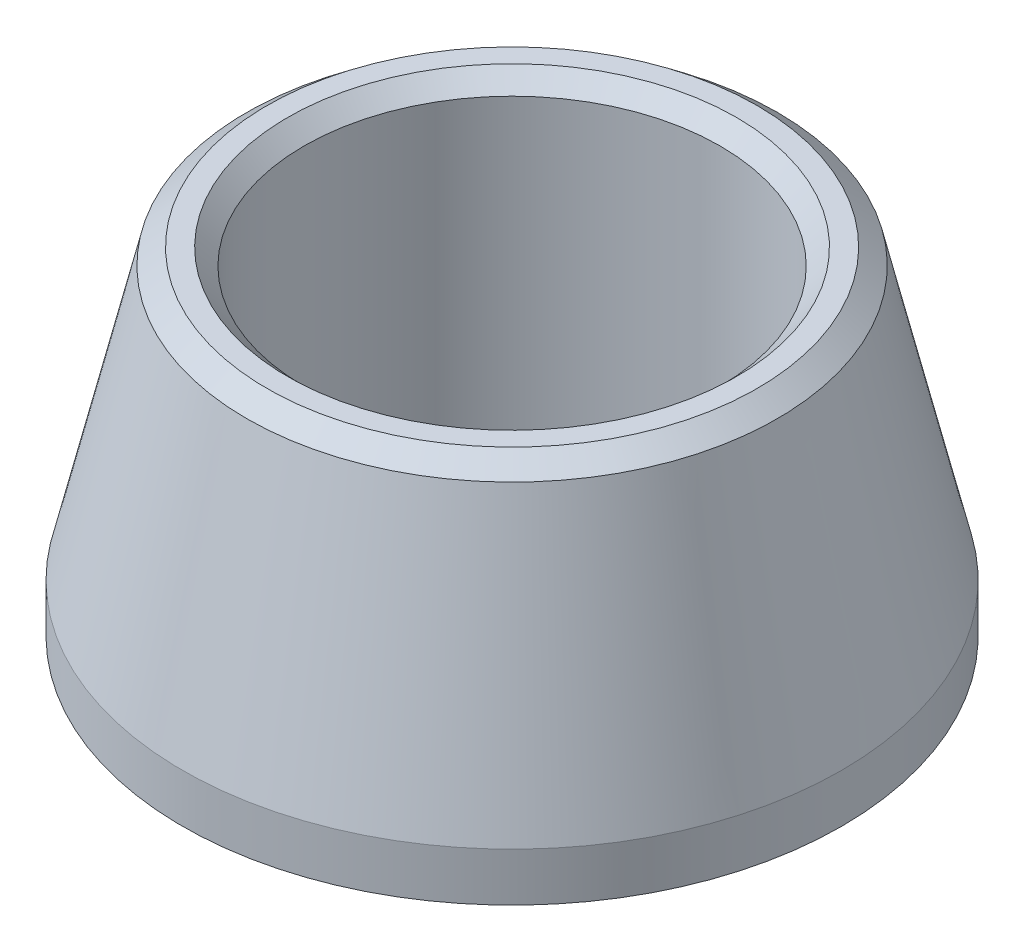
ISO-10303-21;
HEADER;
FILE_DESCRIPTION(('STEP AP214'),'2;1');
FILE_NAME('part.step','',(''),(''),'','','');
FILE_SCHEMA(('AUTOMOTIVE_DESIGN { 1 0 10303 214 1 1 1 1 }'));
ENDSEC;
DATA;
#1=APPLICATION_CONTEXT('core data for automotive mechanical design processes');
#2=APPLICATION_PROTOCOL_DEFINITION('international standard','automotive_design',2000,#1);
#3=PRODUCT_CONTEXT('',#1,'mechanical');
#4=PRODUCT('Part','Part','',(#3));
#5=PRODUCT_RELATED_PRODUCT_CATEGORY('part','',(#4));
#6=PRODUCT_DEFINITION_FORMATION('','',#4);
#7=PRODUCT_DEFINITION_CONTEXT('part definition',#1,'design');
#8=PRODUCT_DEFINITION('design','',#6,#7);
#9=PRODUCT_DEFINITION_SHAPE('','',#8);
#10=(LENGTH_UNIT() NAMED_UNIT(*) SI_UNIT(.MILLI.,.METRE.));
#11=(NAMED_UNIT(*) PLANE_ANGLE_UNIT() SI_UNIT($,.RADIAN.));
#12=(NAMED_UNIT(*) SI_UNIT($,.STERADIAN.) SOLID_ANGLE_UNIT());
#13=UNCERTAINTY_MEASURE_WITH_UNIT(LENGTH_MEASURE(1.E-05),#10,'distance_accuracy_value','');
#14=(GEOMETRIC_REPRESENTATION_CONTEXT(3) GLOBAL_UNCERTAINTY_ASSIGNED_CONTEXT((#13)) GLOBAL_UNIT_ASSIGNED_CONTEXT((#10,
#11,#12)) REPRESENTATION_CONTEXT('',''));
#15=CARTESIAN_POINT('',(0.,0.,0.));
#16=DIRECTION('',(0.,0.,1.));
#17=DIRECTION('',(1.,0.,0.));
#18=AXIS2_PLACEMENT_3D('',#15,#16,#17);
#19=CARTESIAN_POINT('',(0.,-16.2306,0.));
#20=DIRECTION('',(0.,-1.,0.));
#21=DIRECTION('',(0.,0.,1.));
#22=AXIS2_PLACEMENT_3D('',#19,#20,#21);
#23=CYLINDRICAL_SURFACE('',#22,15.875);
#24=CARTESIAN_POINT('',(0.,-13.8938,0.));
#25=DIRECTION('',(0.,-1.,0.));
#26=DIRECTION('',(0.,0.,-1.));
#27=AXIS2_PLACEMENT_3D('',#24,#25,#26);
#28=CIRCLE('',#27,15.875);
#29=CARTESIAN_POINT('',(0.,-13.8938,-15.875));
#30=VERTEX_POINT('',#29);
#31=EDGE_CURVE('E8',#30,#30,#28,.T.);
#32=ORIENTED_EDGE('',*,*,#31,.T.);
#33=EDGE_LOOP('',(#32));
#34=FACE_BOUND('',#33,.T.);
#35=CARTESIAN_POINT('',(0.,-16.2306,0.));
#36=DIRECTION('',(0.,-1.,0.));
#37=DIRECTION('',(1.,0.,0.));
#38=AXIS2_PLACEMENT_3D('',#35,#36,#37);
#39=CIRCLE('',#38,15.875);
#40=CARTESIAN_POINT('',(15.875,-16.2306,0.));
#41=VERTEX_POINT('',#40);
#42=EDGE_CURVE('E41',#41,#41,#39,.T.);
#43=ORIENTED_EDGE('',*,*,#42,.F.);
#44=EDGE_LOOP('',(#43));
#45=FACE_BOUND('',#44,.T.);
#46=ADVANCED_FACE('F13',(#34,#45),#23,.T.);
#47=CARTESIAN_POINT('',(0.,0.,0.));
#48=DIRECTION('',(0.,1.,0.));
#49=DIRECTION('',(0.,0.,1.));
#50=AXIS2_PLACEMENT_3D('',#47,#48,#49);
#51=CONICAL_SURFACE('',#50,10.81278,0.785398163397448);
#52=CARTESIAN_POINT('',(0.,0.,0.));
#53=DIRECTION('',(0.,-1.,0.));
#54=DIRECTION('',(0.,0.,-1.));
#55=AXIS2_PLACEMENT_3D('',#52,#53,#54);
#56=CIRCLE('',#55,10.81278);
#57=CARTESIAN_POINT('',(0.,0.,-10.81278));
#58=VERTEX_POINT('',#57);
#59=EDGE_CURVE('E49',#58,#58,#56,.T.);
#60=ORIENTED_EDGE('',*,*,#59,.F.);
#61=EDGE_LOOP('',(#60));
#62=FACE_BOUND('',#61,.T.);
#63=CARTESIAN_POINT('',(0.,-0.79248,0.));
#64=DIRECTION('',(0.,1.,0.));
#65=DIRECTION('',(0.,0.,-1.));
#66=AXIS2_PLACEMENT_3D('',#63,#64,#65);
#67=CIRCLE('',#66,10.0203);
#68=CARTESIAN_POINT('',(0.,-0.79248,-10.0203));
#69=VERTEX_POINT('',#68);
#70=EDGE_CURVE('E44',#69,#69,#67,.T.);
#71=ORIENTED_EDGE('',*,*,#70,.F.);
#72=EDGE_LOOP('',(#71));
#73=FACE_BOUND('',#72,.T.);
#74=ADVANCED_FACE('F77',(#62,#73),#51,.F.);
#75=CARTESIAN_POINT('',(0.,-16.5608,0.));
#76=DIRECTION('',(0.,-1.,0.));
#77=DIRECTION('',(0.,0.,1.));
#78=AXIS2_PLACEMENT_3D('',#75,#76,#77);
#79=CYLINDRICAL_SURFACE('',#78,13.97);
#80=CARTESIAN_POINT('',(0.,-16.2306,0.));
#81=DIRECTION('',(0.,-1.,0.));
#82=DIRECTION('',(0.,0.,-1.));
#83=AXIS2_PLACEMENT_3D('',#80,#81,#82);
#84=CIRCLE('',#83,13.97);
#85=CARTESIAN_POINT('',(0.,-16.2306,-13.97));
#86=VERTEX_POINT('',#85);
#87=EDGE_CURVE('E21',#86,#86,#84,.T.);
#88=ORIENTED_EDGE('',*,*,#87,.T.);
#89=EDGE_LOOP('',(#88));
#90=FACE_BOUND('',#89,.T.);
#91=CARTESIAN_POINT('',(0.,-16.5608,0.));
#92=DIRECTION('',(0.,1.,0.));
#93=DIRECTION('',(1.,0.,0.));
#94=AXIS2_PLACEMENT_3D('',#91,#92,#93);
#95=CIRCLE('',#94,13.97);
#96=CARTESIAN_POINT('',(13.97,-16.5608,0.));
#97=VERTEX_POINT('',#96);
#98=EDGE_CURVE('E30',#97,#97,#95,.T.);
#99=ORIENTED_EDGE('',*,*,#98,.T.);
#100=EDGE_LOOP('',(#99));
#101=FACE_BOUND('',#100,.T.);
#102=ADVANCED_FACE('F68',(#90,#101),#79,.T.);
#103=CARTESIAN_POINT('',(0.,-16.5608,0.));
#104=DIRECTION('',(0.,1.,0.));
#105=DIRECTION('',(1.,0.,0.));
#106=AXIS2_PLACEMENT_3D('',#103,#104,#105);
#107=PLANE('',#106);
#108=ORIENTED_EDGE('',*,*,#98,.F.);
#109=EDGE_LOOP('',(#108));
#110=FACE_BOUND('',#109,.T.);
#111=CARTESIAN_POINT('',(0.,-16.5608,0.));
#112=DIRECTION('',(0.,-1.,0.));
#113=DIRECTION('',(1.,0.,0.));
#114=AXIS2_PLACEMENT_3D('',#111,#112,#113);
#115=CIRCLE('',#114,10.0203);
#116=CARTESIAN_POINT('',(10.0203,-16.5608,0.));
#117=VERTEX_POINT('',#116);
#118=EDGE_CURVE('E38',#117,#117,#115,.T.);
#119=ORIENTED_EDGE('',*,*,#118,.F.);
#120=EDGE_LOOP('',(#119));
#121=FACE_BOUND('',#120,.T.);
#122=ADVANCED_FACE('F15',(#110,#121),#107,.F.);
#123=CARTESIAN_POINT('',(0.,-0.771321072326124,0.));
#124=DIRECTION('',(0.,-1.,0.));
#125=DIRECTION('',(0.,0.,-1.));
#126=AXIS2_PLACEMENT_3D('',#123,#124,#125);
#127=CONICAL_SURFACE('',#126,12.7803020444791,0.901198209148605);
#128=CARTESIAN_POINT('',(0.,-0.77132107232615,0.));
#129=DIRECTION('',(0.,-1.,0.));
#130=DIRECTION('',(0.,0.,-1.));
#131=AXIS2_PLACEMENT_3D('',#128,#129,#130);
#132=CIRCLE('',#131,12.7803020444791);
#133=CARTESIAN_POINT('',(0.,-0.771321072326169,-12.7803020444791));
#134=VERTEX_POINT('',#133);
#135=EDGE_CURVE('E56',#134,#134,#132,.T.);
#136=ORIENTED_EDGE('',*,*,#135,.F.);
#137=EDGE_LOOP('',(#136));
#138=FACE_BOUND('',#137,.T.);
#139=CARTESIAN_POINT('',(0.,0.,0.));
#140=DIRECTION('',(0.,1.,0.));
#141=DIRECTION('',(0.,0.,-1.));
#142=AXIS2_PLACEMENT_3D('',#139,#140,#141);
#143=CIRCLE('',#142,11.80592);
#144=CARTESIAN_POINT('',(0.,0.,-11.80592));
#145=VERTEX_POINT('',#144);
#146=EDGE_CURVE('E45',#145,#145,#143,.T.);
#147=ORIENTED_EDGE('',*,*,#146,.F.);
#148=EDGE_LOOP('',(#147));
#149=FACE_BOUND('',#148,.T.);
#150=ADVANCED_FACE('F67',(#138,#149),#127,.T.);
#151=CARTESIAN_POINT('',(0.,-16.2306,0.));
#152=DIRECTION('',(0.,-1.,0.));
#153=DIRECTION('',(0.,0.,1.));
#154=AXIS2_PLACEMENT_3D('',#151,#152,#153);
#155=CYLINDRICAL_SURFACE('',#154,10.0203);
#156=ORIENTED_EDGE('',*,*,#118,.T.);
#157=EDGE_LOOP('',(#156));
#158=FACE_BOUND('',#157,.T.);
#159=ORIENTED_EDGE('',*,*,#70,.T.);
#160=EDGE_LOOP('',(#159));
#161=FACE_BOUND('',#160,.T.);
#162=ADVANCED_FACE('F63',(#158,#161),#155,.F.);
#163=CARTESIAN_POINT('',(0.,-16.2306,0.));
#164=DIRECTION('',(0.,-1.,0.));
#165=DIRECTION('',(0.,0.,-1.));
#166=AXIS2_PLACEMENT_3D('',#163,#164,#165);
#167=PLANE('',#166);
#168=ORIENTED_EDGE('',*,*,#42,.T.);
#169=EDGE_LOOP('',(#168));
#170=FACE_BOUND('',#169,.T.);
#171=ORIENTED_EDGE('',*,*,#87,.F.);
#172=EDGE_LOOP('',(#171));
#173=FACE_BOUND('',#172,.T.);
#174=ADVANCED_FACE('F92',(#170,#173),#167,.T.);
#175=CARTESIAN_POINT('',(0.,0.,0.));
#176=DIRECTION('',(0.,-1.,0.));
#177=DIRECTION('',(0.,0.,-1.));
#178=AXIS2_PLACEMENT_3D('',#175,#176,#177);
#179=PLANE('',#178);
#180=ORIENTED_EDGE('',*,*,#146,.T.);
#181=EDGE_LOOP('',(#180));
#182=FACE_BOUND('',#181,.T.);
#183=ORIENTED_EDGE('',*,*,#59,.T.);
#184=EDGE_LOOP('',(#183));
#185=FACE_BOUND('',#184,.T.);
#186=ADVANCED_FACE('F89',(#182,#185),#179,.F.);
#187=CARTESIAN_POINT('',(0.,-13.8938,0.));
#188=DIRECTION('',(0.,-1.,0.));
#189=DIRECTION('',(0.,0.,-1.));
#190=AXIS2_PLACEMENT_3D('',#187,#188,#189);
#191=CONICAL_SURFACE('',#190,15.875,0.231600091502312);
#192=ORIENTED_EDGE('',*,*,#31,.F.);
#193=EDGE_LOOP('',(#192));
#194=FACE_BOUND('',#193,.T.);
#195=ORIENTED_EDGE('',*,*,#135,.T.);
#196=EDGE_LOOP('',(#195));
#197=FACE_BOUND('',#196,.T.);
#198=ADVANCED_FACE('F91',(#194,#197),#191,.T.);
#199=CLOSED_SHELL('',(#46,#74,#102,#122,#150,#162,#174,#186,#198));
#200=MANIFOLD_SOLID_BREP('B1',#199);
#201=ADVANCED_BREP_SHAPE_REPRESENTATION('',(#18,#200),#14);
#202=SHAPE_DEFINITION_REPRESENTATION(#9,#201);
ENDSEC;
END-ISO-10303-21;
